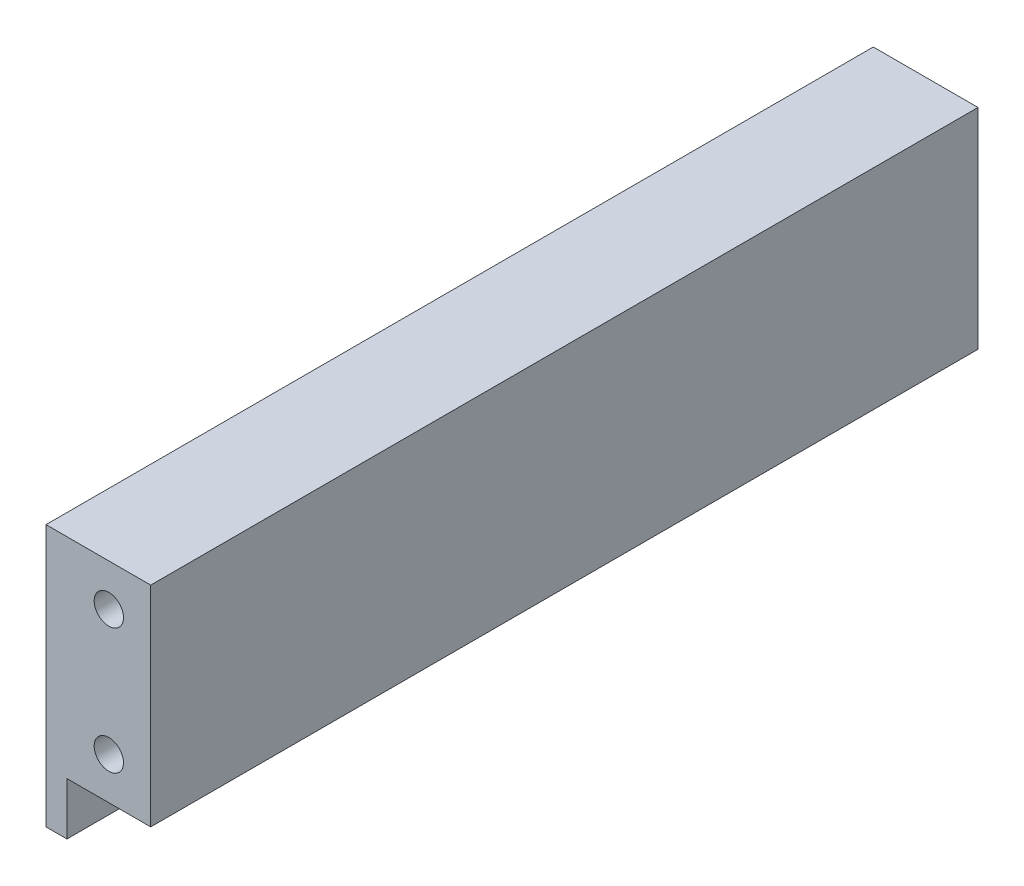
ISO-10303-21;
HEADER;
FILE_DESCRIPTION(('STEP AP214'),'2;1');
FILE_NAME('part.step','',(''),(''),'','','');
FILE_SCHEMA(('AUTOMOTIVE_DESIGN { 1 0 10303 214 1 1 1 1 }'));
ENDSEC;
DATA;
#1=APPLICATION_CONTEXT('core data for automotive mechanical design processes');
#2=APPLICATION_PROTOCOL_DEFINITION('international standard','automotive_design',2000,#1);
#3=PRODUCT_CONTEXT('',#1,'mechanical');
#4=PRODUCT('Part','Part','',(#3));
#5=PRODUCT_RELATED_PRODUCT_CATEGORY('part','',(#4));
#6=PRODUCT_DEFINITION_FORMATION('','',#4);
#7=PRODUCT_DEFINITION_CONTEXT('part definition',#1,'design');
#8=PRODUCT_DEFINITION('design','',#6,#7);
#9=PRODUCT_DEFINITION_SHAPE('','',#8);
#10=(LENGTH_UNIT() NAMED_UNIT(*) SI_UNIT(.MILLI.,.METRE.));
#11=(NAMED_UNIT(*) PLANE_ANGLE_UNIT() SI_UNIT($,.RADIAN.));
#12=(NAMED_UNIT(*) SI_UNIT($,.STERADIAN.) SOLID_ANGLE_UNIT());
#13=UNCERTAINTY_MEASURE_WITH_UNIT(LENGTH_MEASURE(1.E-05),#10,'distance_accuracy_value','');
#14=(GEOMETRIC_REPRESENTATION_CONTEXT(3) GLOBAL_UNCERTAINTY_ASSIGNED_CONTEXT((#13)) GLOBAL_UNIT_ASSIGNED_CONTEXT((#10,
#11,#12)) REPRESENTATION_CONTEXT('',''));
#15=CARTESIAN_POINT('',(0.,0.,0.));
#16=DIRECTION('',(0.,0.,1.));
#17=DIRECTION('',(1.,0.,0.));
#18=AXIS2_PLACEMENT_3D('',#15,#16,#17);
#19=CARTESIAN_POINT('',(4.,-10.,79.));
#20=DIRECTION('',(-1.,0.,0.));
#21=DIRECTION('',(0.,0.,1.));
#22=AXIS2_PLACEMENT_3D('',#19,#20,#21);
#23=PLANE('',#22);
#24=DIRECTION('',(0.,1.,0.));
#25=VECTOR('',#24,1.);
#26=CARTESIAN_POINT('',(4.,-10.,0.));
#27=LINE('',#26,#25);
#28=CARTESIAN_POINT('',(4.,-10.,0.));
#29=VERTEX_POINT('',#28);
#30=CARTESIAN_POINT('',(4.,10.,0.));
#31=VERTEX_POINT('',#30);
#32=EDGE_CURVE('E123',#29,#31,#27,.T.);
#33=ORIENTED_EDGE('',*,*,#32,.T.);
#34=DIRECTION('',(0.,0.,-1.));
#35=VECTOR('',#34,1.);
#36=CARTESIAN_POINT('',(4.,10.,79.));
#37=LINE('',#36,#35);
#38=CARTESIAN_POINT('',(4.,10.,79.));
#39=VERTEX_POINT('',#38);
#40=EDGE_CURVE('E11',#39,#31,#37,.T.);
#41=ORIENTED_EDGE('',*,*,#40,.F.);
#42=DIRECTION('',(0.,1.,0.));
#43=VECTOR('',#42,1.);
#44=CARTESIAN_POINT('',(4.,-10.,79.));
#45=LINE('',#44,#43);
#46=CARTESIAN_POINT('',(4.,-10.,79.));
#47=VERTEX_POINT('',#46);
#48=EDGE_CURVE('E134',#47,#39,#45,.T.);
#49=ORIENTED_EDGE('',*,*,#48,.F.);
#50=DIRECTION('',(0.,0.,-1.));
#51=VECTOR('',#50,1.);
#52=CARTESIAN_POINT('',(4.,-10.,79.));
#53=LINE('',#52,#51);
#54=EDGE_CURVE('E119',#47,#29,#53,.T.);
#55=ORIENTED_EDGE('',*,*,#54,.T.);
#56=EDGE_LOOP('',(#33,#41,#49,#55));
#57=FACE_BOUND('',#56,.T.);
#58=ADVANCED_FACE('F39',(#57),#23,.F.);
#59=CARTESIAN_POINT('',(-4.,10.,79.));
#60=DIRECTION('',(0.,-1.,0.));
#61=DIRECTION('',(0.,0.,-1.));
#62=AXIS2_PLACEMENT_3D('',#59,#60,#61);
#63=PLANE('',#62);
#64=DIRECTION('',(-1.,0.,0.));
#65=VECTOR('',#64,1.);
#66=CARTESIAN_POINT('',(-4.,10.,0.));
#67=LINE('',#66,#65);
#68=CARTESIAN_POINT('',(-6.,10.,0.));
#69=VERTEX_POINT('',#68);
#70=EDGE_CURVE('E126',#31,#69,#67,.T.);
#71=ORIENTED_EDGE('',*,*,#70,.T.);
#72=DIRECTION('',(0.,0.,-1.));
#73=VECTOR('',#72,1.);
#74=CARTESIAN_POINT('',(-6.,10.,79.));
#75=LINE('',#74,#73);
#76=CARTESIAN_POINT('',(-6.,10.,79.));
#77=VERTEX_POINT('',#76);
#78=EDGE_CURVE('E47',#77,#69,#75,.T.);
#79=ORIENTED_EDGE('',*,*,#78,.F.);
#80=DIRECTION('',(-1.,0.,0.));
#81=VECTOR('',#80,1.);
#82=CARTESIAN_POINT('',(-4.,10.,79.));
#83=LINE('',#82,#81);
#84=EDGE_CURVE('E92',#39,#77,#83,.T.);
#85=ORIENTED_EDGE('',*,*,#84,.F.);
#86=ORIENTED_EDGE('',*,*,#40,.T.);
#87=EDGE_LOOP('',(#71,#79,#85,#86));
#88=FACE_BOUND('',#87,.T.);
#89=ADVANCED_FACE('F159',(#88),#63,.F.);
#90=CARTESIAN_POINT('',(-6.,10.,79.));
#91=DIRECTION('',(1.,0.,0.));
#92=DIRECTION('',(0.,1.,0.));
#93=AXIS2_PLACEMENT_3D('',#90,#91,#92);
#94=PLANE('',#93);
#95=DIRECTION('',(0.,-1.,0.));
#96=VECTOR('',#95,1.);
#97=CARTESIAN_POINT('',(-6.,10.,0.));
#98=LINE('',#97,#96);
#99=CARTESIAN_POINT('',(-6.,-15.,0.));
#100=VERTEX_POINT('',#99);
#101=EDGE_CURVE('E129',#69,#100,#98,.T.);
#102=ORIENTED_EDGE('',*,*,#101,.T.);
#103=DIRECTION('',(0.,0.,-1.));
#104=VECTOR('',#103,1.);
#105=CARTESIAN_POINT('',(-6.,-15.,79.));
#106=LINE('',#105,#104);
#107=CARTESIAN_POINT('',(-6.,-15.,79.));
#108=VERTEX_POINT('',#107);
#109=EDGE_CURVE('E114',#108,#100,#106,.T.);
#110=ORIENTED_EDGE('',*,*,#109,.F.);
#111=DIRECTION('',(0.,-1.,0.));
#112=VECTOR('',#111,1.);
#113=CARTESIAN_POINT('',(-6.,10.,79.));
#114=LINE('',#113,#112);
#115=EDGE_CURVE('E105',#77,#108,#114,.T.);
#116=ORIENTED_EDGE('',*,*,#115,.F.);
#117=ORIENTED_EDGE('',*,*,#78,.T.);
#118=EDGE_LOOP('',(#102,#110,#116,#117));
#119=FACE_BOUND('',#118,.T.);
#120=ADVANCED_FACE('F140',(#119),#94,.F.);
#121=CARTESIAN_POINT('',(-6.,-15.,79.));
#122=DIRECTION('',(0.,1.,0.));
#123=DIRECTION('',(0.,0.,1.));
#124=AXIS2_PLACEMENT_3D('',#121,#122,#123);
#125=PLANE('',#124);
#126=DIRECTION('',(1.,0.,0.));
#127=VECTOR('',#126,1.);
#128=CARTESIAN_POINT('',(-6.,-15.,0.));
#129=LINE('',#128,#127);
#130=CARTESIAN_POINT('',(-4.,-15.,0.));
#131=VERTEX_POINT('',#130);
#132=EDGE_CURVE('E113',#100,#131,#129,.T.);
#133=ORIENTED_EDGE('',*,*,#132,.T.);
#134=DIRECTION('',(0.,0.,-1.));
#135=VECTOR('',#134,1.);
#136=CARTESIAN_POINT('',(-4.,-15.,79.));
#137=LINE('',#136,#135);
#138=CARTESIAN_POINT('',(-4.,-15.,79.));
#139=VERTEX_POINT('',#138);
#140=EDGE_CURVE('E110',#139,#131,#137,.T.);
#141=ORIENTED_EDGE('',*,*,#140,.F.);
#142=DIRECTION('',(1.,0.,0.));
#143=VECTOR('',#142,1.);
#144=CARTESIAN_POINT('',(-6.,-15.,79.));
#145=LINE('',#144,#143);
#146=EDGE_CURVE('E99',#108,#139,#145,.T.);
#147=ORIENTED_EDGE('',*,*,#146,.F.);
#148=ORIENTED_EDGE('',*,*,#109,.T.);
#149=EDGE_LOOP('',(#133,#141,#147,#148));
#150=FACE_BOUND('',#149,.T.);
#151=ADVANCED_FACE('F111',(#150),#125,.F.);
#152=CARTESIAN_POINT('',(-4.,-15.,79.));
#153=DIRECTION('',(-1.,0.,0.));
#154=DIRECTION('',(0.,0.,1.));
#155=AXIS2_PLACEMENT_3D('',#152,#153,#154);
#156=PLANE('',#155);
#157=DIRECTION('',(0.,1.,0.));
#158=VECTOR('',#157,1.);
#159=CARTESIAN_POINT('',(-4.,-15.,0.));
#160=LINE('',#159,#158);
#161=CARTESIAN_POINT('',(-4.,-10.,0.));
#162=VERTEX_POINT('',#161);
#163=EDGE_CURVE('E78',#131,#162,#160,.T.);
#164=ORIENTED_EDGE('',*,*,#163,.T.);
#165=DIRECTION('',(0.,0.,-1.));
#166=VECTOR('',#165,1.);
#167=CARTESIAN_POINT('',(-4.,-10.,79.));
#168=LINE('',#167,#166);
#169=CARTESIAN_POINT('',(-4.,-10.,79.));
#170=VERTEX_POINT('',#169);
#171=EDGE_CURVE('E115',#170,#162,#168,.T.);
#172=ORIENTED_EDGE('',*,*,#171,.F.);
#173=DIRECTION('',(0.,1.,0.));
#174=VECTOR('',#173,1.);
#175=CARTESIAN_POINT('',(-4.,-15.,79.));
#176=LINE('',#175,#174);
#177=EDGE_CURVE('E103',#139,#170,#176,.T.);
#178=ORIENTED_EDGE('',*,*,#177,.F.);
#179=ORIENTED_EDGE('',*,*,#140,.T.);
#180=EDGE_LOOP('',(#164,#172,#178,#179));
#181=FACE_BOUND('',#180,.T.);
#182=ADVANCED_FACE('F117',(#181),#156,.F.);
#183=CARTESIAN_POINT('',(-4.,-10.,79.));
#184=DIRECTION('',(0.,1.,0.));
#185=DIRECTION('',(0.,0.,1.));
#186=AXIS2_PLACEMENT_3D('',#183,#184,#185);
#187=PLANE('',#186);
#188=DIRECTION('',(1.,0.,0.));
#189=VECTOR('',#188,1.);
#190=CARTESIAN_POINT('',(-4.,-10.,0.));
#191=LINE('',#190,#189);
#192=EDGE_CURVE('E84',#162,#29,#191,.T.);
#193=ORIENTED_EDGE('',*,*,#192,.T.);
#194=ORIENTED_EDGE('',*,*,#54,.F.);
#195=DIRECTION('',(1.,0.,0.));
#196=VECTOR('',#195,1.);
#197=CARTESIAN_POINT('',(-4.,-10.,79.));
#198=LINE('',#197,#196);
#199=EDGE_CURVE('E55',#170,#47,#198,.T.);
#200=ORIENTED_EDGE('',*,*,#199,.F.);
#201=ORIENTED_EDGE('',*,*,#171,.T.);
#202=EDGE_LOOP('',(#193,#194,#200,#201));
#203=FACE_BOUND('',#202,.T.);
#204=ADVANCED_FACE('F147',(#203),#187,.F.);
#205=CARTESIAN_POINT('',(0.,0.,79.));
#206=DIRECTION('',(0.,0.,-1.));
#207=DIRECTION('',(-1.,0.,0.));
#208=AXIS2_PLACEMENT_3D('',#205,#206,#207);
#209=PLANE('',#208);
#210=CARTESIAN_POINT('',(0.,6.,79.));
#211=DIRECTION('',(0.,0.,-1.));
#212=DIRECTION('',(-1.,0.,0.));
#213=AXIS2_PLACEMENT_3D('',#210,#211,#212);
#214=CIRCLE('',#213,1.4);
#215=CARTESIAN_POINT('',(-1.4,6.,79.));
#216=VERTEX_POINT('',#215);
#217=EDGE_CURVE('E127',#216,#216,#214,.T.);
#218=ORIENTED_EDGE('',*,*,#217,.T.);
#219=EDGE_LOOP('',(#218));
#220=FACE_BOUND('',#219,.T.);
#221=CARTESIAN_POINT('',(0.,-6.,79.));
#222=DIRECTION('',(0.,0.,-1.));
#223=DIRECTION('',(-1.,0.,0.));
#224=AXIS2_PLACEMENT_3D('',#221,#222,#223);
#225=CIRCLE('',#224,1.4);
#226=CARTESIAN_POINT('',(-1.4,-6.,79.));
#227=VERTEX_POINT('',#226);
#228=EDGE_CURVE('E230',#227,#227,#225,.T.);
#229=ORIENTED_EDGE('',*,*,#228,.T.);
#230=EDGE_LOOP('',(#229));
#231=FACE_BOUND('',#230,.T.);
#232=ORIENTED_EDGE('',*,*,#48,.T.);
#233=ORIENTED_EDGE('',*,*,#84,.T.);
#234=ORIENTED_EDGE('',*,*,#115,.T.);
#235=ORIENTED_EDGE('',*,*,#146,.T.);
#236=ORIENTED_EDGE('',*,*,#177,.T.);
#237=ORIENTED_EDGE('',*,*,#199,.T.);
#238=EDGE_LOOP('',(#232,#233,#234,#235,#236,#237));
#239=FACE_BOUND('',#238,.T.);
#240=ADVANCED_FACE('F101',(#220,#231,#239),#209,.F.);
#241=CARTESIAN_POINT('',(0.,0.,0.));
#242=DIRECTION('',(0.,0.,-1.));
#243=DIRECTION('',(-1.,0.,0.));
#244=AXIS2_PLACEMENT_3D('',#241,#242,#243);
#245=PLANE('',#244);
#246=CARTESIAN_POINT('',(0.,6.,0.));
#247=DIRECTION('',(0.,0.,-1.));
#248=DIRECTION('',(-1.,0.,0.));
#249=AXIS2_PLACEMENT_3D('',#246,#247,#248);
#250=CIRCLE('',#249,1.4);
#251=CARTESIAN_POINT('',(-1.4,6.,0.));
#252=VERTEX_POINT('',#251);
#253=EDGE_CURVE('E225',#252,#252,#250,.T.);
#254=ORIENTED_EDGE('',*,*,#253,.F.);
#255=EDGE_LOOP('',(#254));
#256=FACE_BOUND('',#255,.T.);
#257=CARTESIAN_POINT('',(0.,-6.,0.));
#258=DIRECTION('',(0.,0.,-1.));
#259=DIRECTION('',(-1.,0.,0.));
#260=AXIS2_PLACEMENT_3D('',#257,#258,#259);
#261=CIRCLE('',#260,1.4);
#262=CARTESIAN_POINT('',(-1.4,-6.,0.));
#263=VERTEX_POINT('',#262);
#264=EDGE_CURVE('E226',#263,#263,#261,.T.);
#265=ORIENTED_EDGE('',*,*,#264,.F.);
#266=EDGE_LOOP('',(#265));
#267=FACE_BOUND('',#266,.T.);
#268=ORIENTED_EDGE('',*,*,#32,.F.);
#269=ORIENTED_EDGE('',*,*,#192,.F.);
#270=ORIENTED_EDGE('',*,*,#163,.F.);
#271=ORIENTED_EDGE('',*,*,#132,.F.);
#272=ORIENTED_EDGE('',*,*,#101,.F.);
#273=ORIENTED_EDGE('',*,*,#70,.F.);
#274=EDGE_LOOP('',(#268,#269,#270,#271,#272,#273));
#275=FACE_BOUND('',#274,.T.);
#276=ADVANCED_FACE('F143',(#256,#267,#275),#245,.T.);
#277=CARTESIAN_POINT('',(0.,-6.,79.));
#278=DIRECTION('',(0.,0.,-1.));
#279=DIRECTION('',(-1.,0.,0.));
#280=AXIS2_PLACEMENT_3D('',#277,#278,#279);
#281=CYLINDRICAL_SURFACE('',#280,1.4);
#282=ORIENTED_EDGE('',*,*,#228,.F.);
#283=EDGE_LOOP('',(#282));
#284=FACE_BOUND('',#283,.T.);
#285=ORIENTED_EDGE('',*,*,#264,.T.);
#286=EDGE_LOOP('',(#285));
#287=FACE_BOUND('',#286,.T.);
#288=ADVANCED_FACE('F198',(#284,#287),#281,.F.);
#289=CARTESIAN_POINT('',(0.,6.,79.));
#290=DIRECTION('',(0.,0.,-1.));
#291=DIRECTION('',(-1.,0.,0.));
#292=AXIS2_PLACEMENT_3D('',#289,#290,#291);
#293=CYLINDRICAL_SURFACE('',#292,1.4);
#294=ORIENTED_EDGE('',*,*,#217,.F.);
#295=EDGE_LOOP('',(#294));
#296=FACE_BOUND('',#295,.T.);
#297=ORIENTED_EDGE('',*,*,#253,.T.);
#298=EDGE_LOOP('',(#297));
#299=FACE_BOUND('',#298,.T.);
#300=ADVANCED_FACE('F207',(#296,#299),#293,.F.);
#301=CLOSED_SHELL('',(#58,#89,#120,#151,#182,#204,#240,#276,#288,#300));
#302=MANIFOLD_SOLID_BREP('B2',#301);
#303=ADVANCED_BREP_SHAPE_REPRESENTATION('',(#18,#302),#14);
#304=SHAPE_DEFINITION_REPRESENTATION(#9,#303);
ENDSEC;
END-ISO-10303-21;
